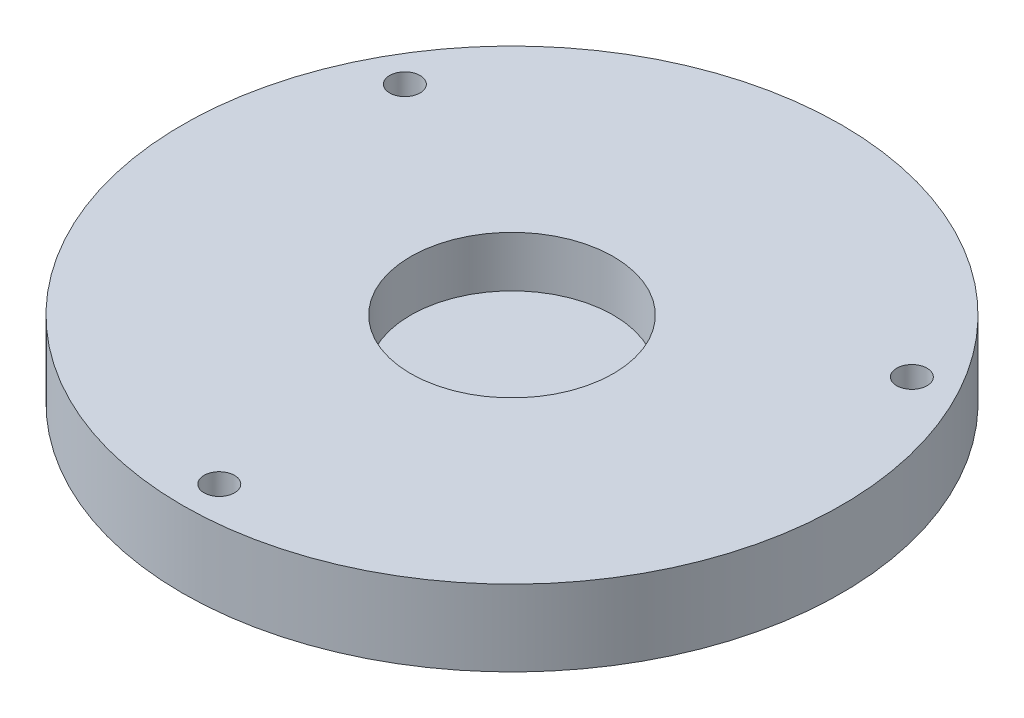
ISO-10303-21;
HEADER;
FILE_DESCRIPTION(('STEP AP214'),'2;1');
FILE_NAME('part.step','',(''),(''),'','','');
FILE_SCHEMA(('AUTOMOTIVE_DESIGN { 1 0 10303 214 1 1 1 1 }'));
ENDSEC;
DATA;
#1=APPLICATION_CONTEXT('core data for automotive mechanical design processes');
#2=APPLICATION_PROTOCOL_DEFINITION('international standard','automotive_design',2000,#1);
#3=PRODUCT_CONTEXT('',#1,'mechanical');
#4=PRODUCT('Part','Part','',(#3));
#5=PRODUCT_RELATED_PRODUCT_CATEGORY('part','',(#4));
#6=PRODUCT_DEFINITION_FORMATION('','',#4);
#7=PRODUCT_DEFINITION_CONTEXT('part definition',#1,'design');
#8=PRODUCT_DEFINITION('design','',#6,#7);
#9=PRODUCT_DEFINITION_SHAPE('','',#8);
#10=(LENGTH_UNIT() NAMED_UNIT(*) SI_UNIT(.MILLI.,.METRE.));
#11=(NAMED_UNIT(*) PLANE_ANGLE_UNIT() SI_UNIT($,.RADIAN.));
#12=(NAMED_UNIT(*) SI_UNIT($,.STERADIAN.) SOLID_ANGLE_UNIT());
#13=UNCERTAINTY_MEASURE_WITH_UNIT(LENGTH_MEASURE(1.E-05),#10,'distance_accuracy_value','');
#14=(GEOMETRIC_REPRESENTATION_CONTEXT(3) GLOBAL_UNCERTAINTY_ASSIGNED_CONTEXT((#13)) GLOBAL_UNIT_ASSIGNED_CONTEXT((#10,
#11,#12)) REPRESENTATION_CONTEXT('',''));
#15=CARTESIAN_POINT('',(0.,0.,0.));
#16=DIRECTION('',(0.,0.,1.));
#17=DIRECTION('',(1.,0.,0.));
#18=AXIS2_PLACEMENT_3D('',#15,#16,#17);
#19=CARTESIAN_POINT('',(0.,15.,0.));
#20=DIRECTION('',(0.,-1.,0.));
#21=DIRECTION('',(0.,0.,-1.));
#22=AXIS2_PLACEMENT_3D('',#19,#20,#21);
#23=CYLINDRICAL_SURFACE('',#22,65.);
#24=CARTESIAN_POINT('',(0.,15.,0.));
#25=DIRECTION('',(0.,1.,0.));
#26=DIRECTION('',(0.,0.,1.));
#27=AXIS2_PLACEMENT_3D('',#24,#25,#26);
#28=CIRCLE('',#27,65.);
#29=CARTESIAN_POINT('',(0.,15.,65.));
#30=VERTEX_POINT('',#29);
#31=EDGE_CURVE('E10',#30,#30,#28,.T.);
#32=ORIENTED_EDGE('',*,*,#31,.F.);
#33=EDGE_LOOP('',(#32));
#34=FACE_BOUND('',#33,.T.);
#35=CARTESIAN_POINT('',(0.,0.,0.));
#36=DIRECTION('',(0.,1.,0.));
#37=DIRECTION('',(0.,0.,1.));
#38=AXIS2_PLACEMENT_3D('',#35,#36,#37);
#39=CIRCLE('',#38,65.);
#40=CARTESIAN_POINT('',(0.,0.,65.));
#41=VERTEX_POINT('',#40);
#42=EDGE_CURVE('E35',#41,#41,#39,.T.);
#43=ORIENTED_EDGE('',*,*,#42,.T.);
#44=EDGE_LOOP('',(#43));
#45=FACE_BOUND('',#44,.T.);
#46=ADVANCED_FACE('F32',(#34,#45),#23,.T.);
#47=CARTESIAN_POINT('',(0.,15.,0.));
#48=DIRECTION('',(0.,1.,0.));
#49=DIRECTION('',(0.,0.,1.));
#50=AXIS2_PLACEMENT_3D('',#47,#48,#49);
#51=PLANE('',#50);
#52=CARTESIAN_POINT('',(-50.,15.,-28.8675134594813));
#53=DIRECTION('',(0.,-1.,0.));
#54=DIRECTION('',(0.,0.,-1.));
#55=AXIS2_PLACEMENT_3D('',#52,#53,#54);
#56=CIRCLE('',#55,3.);
#57=CARTESIAN_POINT('',(-50.,15.,-31.8675134594813));
#58=VERTEX_POINT('',#57);
#59=EDGE_CURVE('E62',#58,#58,#56,.T.);
#60=ORIENTED_EDGE('',*,*,#59,.T.);
#61=EDGE_LOOP('',(#60));
#62=FACE_BOUND('',#61,.T.);
#63=CARTESIAN_POINT('',(50.,15.,-28.8675134594813));
#64=DIRECTION('',(0.,-1.,0.));
#65=DIRECTION('',(0.,0.,-1.));
#66=AXIS2_PLACEMENT_3D('',#63,#64,#65);
#67=CIRCLE('',#66,3.);
#68=CARTESIAN_POINT('',(50.,15.,-31.8675134594813));
#69=VERTEX_POINT('',#68);
#70=EDGE_CURVE('E56',#69,#69,#67,.T.);
#71=ORIENTED_EDGE('',*,*,#70,.T.);
#72=EDGE_LOOP('',(#71));
#73=FACE_BOUND('',#72,.T.);
#74=CARTESIAN_POINT('',(0.,15.,57.7350269189626));
#75=DIRECTION('',(0.,-1.,0.));
#76=DIRECTION('',(0.,0.,-1.));
#77=AXIS2_PLACEMENT_3D('',#74,#75,#76);
#78=CIRCLE('',#77,3.);
#79=CARTESIAN_POINT('',(0.,15.,54.7350269189626));
#80=VERTEX_POINT('',#79);
#81=EDGE_CURVE('E47',#80,#80,#78,.T.);
#82=ORIENTED_EDGE('',*,*,#81,.T.);
#83=EDGE_LOOP('',(#82));
#84=FACE_BOUND('',#83,.T.);
#85=CARTESIAN_POINT('',(0.,15.,0.));
#86=DIRECTION('',(0.,1.,0.));
#87=DIRECTION('',(0.,0.,1.));
#88=AXIS2_PLACEMENT_3D('',#85,#86,#87);
#89=CIRCLE('',#88,20.);
#90=CARTESIAN_POINT('',(0.,15.,20.));
#91=VERTEX_POINT('',#90);
#92=EDGE_CURVE('E44',#91,#91,#89,.T.);
#93=ORIENTED_EDGE('',*,*,#92,.F.);
#94=EDGE_LOOP('',(#93));
#95=FACE_BOUND('',#94,.T.);
#96=ORIENTED_EDGE('',*,*,#31,.T.);
#97=EDGE_LOOP('',(#96));
#98=FACE_BOUND('',#97,.T.);
#99=ADVANCED_FACE('F74',(#62,#73,#84,#95,#98),#51,.T.);
#100=CARTESIAN_POINT('',(0.,0.,0.));
#101=DIRECTION('',(0.,1.,0.));
#102=DIRECTION('',(0.,0.,1.));
#103=AXIS2_PLACEMENT_3D('',#100,#101,#102);
#104=PLANE('',#103);
#105=CARTESIAN_POINT('',(-50.,0.,-28.8675134594813));
#106=DIRECTION('',(0.,-1.,0.));
#107=DIRECTION('',(0.,0.,-1.));
#108=AXIS2_PLACEMENT_3D('',#105,#106,#107);
#109=CIRCLE('',#108,3.);
#110=CARTESIAN_POINT('',(-50.,0.,-31.8675134594813));
#111=VERTEX_POINT('',#110);
#112=EDGE_CURVE('E53',#111,#111,#109,.T.);
#113=ORIENTED_EDGE('',*,*,#112,.F.);
#114=EDGE_LOOP('',(#113));
#115=FACE_BOUND('',#114,.T.);
#116=CARTESIAN_POINT('',(50.,0.,-28.8675134594813));
#117=DIRECTION('',(0.,-1.,0.));
#118=DIRECTION('',(0.,0.,-1.));
#119=AXIS2_PLACEMENT_3D('',#116,#117,#118);
#120=CIRCLE('',#119,3.);
#121=CARTESIAN_POINT('',(50.,0.,-31.8675134594813));
#122=VERTEX_POINT('',#121);
#123=EDGE_CURVE('E59',#122,#122,#120,.T.);
#124=ORIENTED_EDGE('',*,*,#123,.F.);
#125=EDGE_LOOP('',(#124));
#126=FACE_BOUND('',#125,.T.);
#127=CARTESIAN_POINT('',(0.,0.,57.7350269189626));
#128=DIRECTION('',(0.,-1.,0.));
#129=DIRECTION('',(0.,0.,-1.));
#130=AXIS2_PLACEMENT_3D('',#127,#128,#129);
#131=CIRCLE('',#130,3.);
#132=CARTESIAN_POINT('',(0.,0.,54.7350269189626));
#133=VERTEX_POINT('',#132);
#134=EDGE_CURVE('E50',#133,#133,#131,.T.);
#135=ORIENTED_EDGE('',*,*,#134,.F.);
#136=EDGE_LOOP('',(#135));
#137=FACE_BOUND('',#136,.T.);
#138=ORIENTED_EDGE('',*,*,#42,.F.);
#139=EDGE_LOOP('',(#138));
#140=FACE_BOUND('',#139,.T.);
#141=ADVANCED_FACE('F70',(#115,#126,#137,#140),#104,.F.);
#142=CARTESIAN_POINT('',(0.,5.,0.));
#143=DIRECTION('',(0.,1.,0.));
#144=DIRECTION('',(0.,0.,1.));
#145=AXIS2_PLACEMENT_3D('',#142,#143,#144);
#146=CYLINDRICAL_SURFACE('',#145,20.);
#147=CARTESIAN_POINT('',(0.,5.,0.));
#148=DIRECTION('',(0.,1.,0.));
#149=DIRECTION('',(0.,0.,1.));
#150=AXIS2_PLACEMENT_3D('',#147,#148,#149);
#151=CIRCLE('',#150,20.);
#152=CARTESIAN_POINT('',(0.,5.,20.));
#153=VERTEX_POINT('',#152);
#154=EDGE_CURVE('E42',#153,#153,#151,.T.);
#155=ORIENTED_EDGE('',*,*,#154,.F.);
#156=EDGE_LOOP('',(#155));
#157=FACE_BOUND('',#156,.T.);
#158=ORIENTED_EDGE('',*,*,#92,.T.);
#159=EDGE_LOOP('',(#158));
#160=FACE_BOUND('',#159,.T.);
#161=ADVANCED_FACE('F73',(#157,#160),#146,.F.);
#162=CARTESIAN_POINT('',(0.,5.,0.));
#163=DIRECTION('',(0.,1.,0.));
#164=DIRECTION('',(0.,0.,1.));
#165=AXIS2_PLACEMENT_3D('',#162,#163,#164);
#166=PLANE('',#165);
#167=ORIENTED_EDGE('',*,*,#154,.T.);
#168=EDGE_LOOP('',(#167));
#169=FACE_BOUND('',#168,.T.);
#170=ADVANCED_FACE('F94',(#169),#166,.T.);
#171=CARTESIAN_POINT('',(0.,15.,57.7350269189626));
#172=DIRECTION('',(0.,-1.,0.));
#173=DIRECTION('',(0.,0.,-1.));
#174=AXIS2_PLACEMENT_3D('',#171,#172,#173);
#175=CYLINDRICAL_SURFACE('',#174,3.);
#176=ORIENTED_EDGE('',*,*,#81,.F.);
#177=EDGE_LOOP('',(#176));
#178=FACE_BOUND('',#177,.T.);
#179=ORIENTED_EDGE('',*,*,#134,.T.);
#180=EDGE_LOOP('',(#179));
#181=FACE_BOUND('',#180,.T.);
#182=ADVANCED_FACE('F98',(#178,#181),#175,.F.);
#183=CARTESIAN_POINT('',(50.,15.,-28.8675134594813));
#184=DIRECTION('',(0.,-1.,0.));
#185=DIRECTION('',(0.,0.,-1.));
#186=AXIS2_PLACEMENT_3D('',#183,#184,#185);
#187=CYLINDRICAL_SURFACE('',#186,3.);
#188=ORIENTED_EDGE('',*,*,#70,.F.);
#189=EDGE_LOOP('',(#188));
#190=FACE_BOUND('',#189,.T.);
#191=ORIENTED_EDGE('',*,*,#123,.T.);
#192=EDGE_LOOP('',(#191));
#193=FACE_BOUND('',#192,.T.);
#194=ADVANCED_FACE('F102',(#190,#193),#187,.F.);
#195=CARTESIAN_POINT('',(-50.,15.,-28.8675134594813));
#196=DIRECTION('',(0.,-1.,0.));
#197=DIRECTION('',(0.,0.,-1.));
#198=AXIS2_PLACEMENT_3D('',#195,#196,#197);
#199=CYLINDRICAL_SURFACE('',#198,3.);
#200=ORIENTED_EDGE('',*,*,#59,.F.);
#201=EDGE_LOOP('',(#200));
#202=FACE_BOUND('',#201,.T.);
#203=ORIENTED_EDGE('',*,*,#112,.T.);
#204=EDGE_LOOP('',(#203));
#205=FACE_BOUND('',#204,.T.);
#206=ADVANCED_FACE('F68',(#202,#205),#199,.F.);
#207=CLOSED_SHELL('',(#46,#99,#141,#161,#170,#182,#194,#206));
#208=MANIFOLD_SOLID_BREP('B2',#207);
#209=ADVANCED_BREP_SHAPE_REPRESENTATION('',(#18,#208),#14);
#210=SHAPE_DEFINITION_REPRESENTATION(#9,#209);
ENDSEC;
END-ISO-10303-21;
